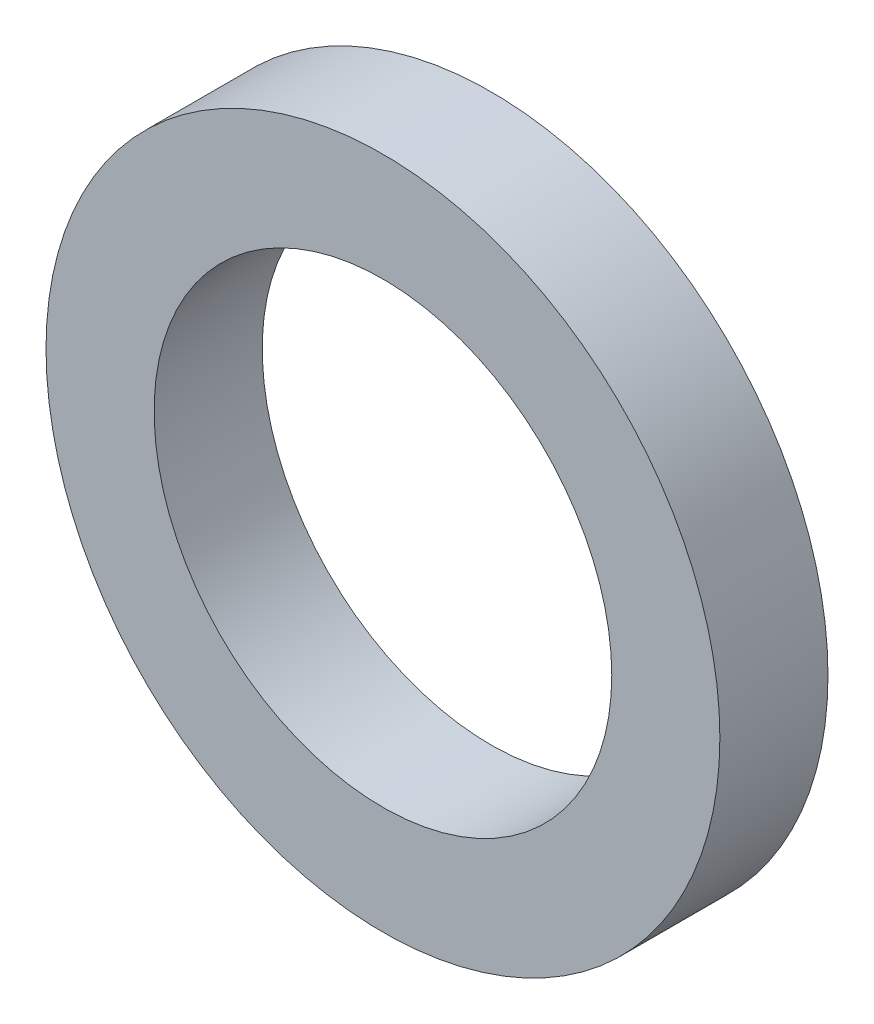
ISO-10303-21;
HEADER;
FILE_DESCRIPTION(('STEP AP214'),'2;1');
FILE_NAME('part.step','',(''),(''),'','','');
FILE_SCHEMA(('AUTOMOTIVE_DESIGN { 1 0 10303 214 1 1 1 1 }'));
ENDSEC;
DATA;
#1=APPLICATION_CONTEXT('core data for automotive mechanical design processes');
#2=APPLICATION_PROTOCOL_DEFINITION('international standard','automotive_design',2000,#1);
#3=PRODUCT_CONTEXT('',#1,'mechanical');
#4=PRODUCT('Part','Part','',(#3));
#5=PRODUCT_RELATED_PRODUCT_CATEGORY('part','',(#4));
#6=PRODUCT_DEFINITION_FORMATION('','',#4);
#7=PRODUCT_DEFINITION_CONTEXT('part definition',#1,'design');
#8=PRODUCT_DEFINITION('design','',#6,#7);
#9=PRODUCT_DEFINITION_SHAPE('','',#8);
#10=(LENGTH_UNIT() NAMED_UNIT(*) SI_UNIT(.MILLI.,.METRE.));
#11=(NAMED_UNIT(*) PLANE_ANGLE_UNIT() SI_UNIT($,.RADIAN.));
#12=(NAMED_UNIT(*) SI_UNIT($,.STERADIAN.) SOLID_ANGLE_UNIT());
#13=UNCERTAINTY_MEASURE_WITH_UNIT(LENGTH_MEASURE(1.E-05),#10,'distance_accuracy_value','');
#14=(GEOMETRIC_REPRESENTATION_CONTEXT(3) GLOBAL_UNCERTAINTY_ASSIGNED_CONTEXT((#13)) GLOBAL_UNIT_ASSIGNED_CONTEXT((#10,
#11,#12)) REPRESENTATION_CONTEXT('',''));
#15=CARTESIAN_POINT('',(0.,0.,0.));
#16=DIRECTION('',(0.,0.,1.));
#17=DIRECTION('',(1.,0.,0.));
#18=AXIS2_PLACEMENT_3D('',#15,#16,#17);
#19=CARTESIAN_POINT('',(0.,0.,3.));
#20=DIRECTION('',(0.,0.,1.));
#21=DIRECTION('',(1.,0.,0.));
#22=AXIS2_PLACEMENT_3D('',#19,#20,#21);
#23=PLANE('',#22);
#24=CARTESIAN_POINT('',(0.,0.,3.));
#25=DIRECTION('',(0.,0.,1.));
#26=DIRECTION('',(1.,0.,0.));
#27=AXIS2_PLACEMENT_3D('',#24,#25,#26);
#28=CIRCLE('',#27,9.35);
#29=CARTESIAN_POINT('',(9.35,0.,3.));
#30=VERTEX_POINT('',#29);
#31=EDGE_CURVE('E10',#30,#30,#28,.T.);
#32=ORIENTED_EDGE('',*,*,#31,.T.);
#33=EDGE_LOOP('',(#32));
#34=FACE_BOUND('',#33,.T.);
#35=CARTESIAN_POINT('',(0.,0.,3.));
#36=DIRECTION('',(0.,0.,1.));
#37=DIRECTION('',(1.,0.,0.));
#38=AXIS2_PLACEMENT_3D('',#35,#36,#37);
#39=CIRCLE('',#38,6.35);
#40=CARTESIAN_POINT('',(6.35,0.,3.));
#41=VERTEX_POINT('',#40);
#42=EDGE_CURVE('E56',#41,#41,#39,.T.);
#43=ORIENTED_EDGE('',*,*,#42,.F.);
#44=EDGE_LOOP('',(#43));
#45=FACE_BOUND('',#44,.T.);
#46=ADVANCED_FACE('F43',(#34,#45),#23,.T.);
#47=CARTESIAN_POINT('',(0.,0.,0.));
#48=DIRECTION('',(0.,0.,1.));
#49=DIRECTION('',(1.,0.,0.));
#50=AXIS2_PLACEMENT_3D('',#47,#48,#49);
#51=PLANE('',#50);
#52=CARTESIAN_POINT('',(0.,0.,0.));
#53=DIRECTION('',(0.,0.,1.));
#54=DIRECTION('',(1.,0.,0.));
#55=AXIS2_PLACEMENT_3D('',#52,#53,#54);
#56=CIRCLE('',#55,9.35);
#57=CARTESIAN_POINT('',(9.35,0.,0.));
#58=VERTEX_POINT('',#57);
#59=EDGE_CURVE('E47',#58,#58,#56,.T.);
#60=ORIENTED_EDGE('',*,*,#59,.F.);
#61=EDGE_LOOP('',(#60));
#62=FACE_BOUND('',#61,.T.);
#63=CARTESIAN_POINT('',(0.,0.,0.));
#64=DIRECTION('',(0.,0.,1.));
#65=DIRECTION('',(1.,0.,0.));
#66=AXIS2_PLACEMENT_3D('',#63,#64,#65);
#67=CIRCLE('',#66,6.35);
#68=CARTESIAN_POINT('',(6.35,0.,0.));
#69=VERTEX_POINT('',#68);
#70=EDGE_CURVE('E58',#69,#69,#67,.T.);
#71=ORIENTED_EDGE('',*,*,#70,.T.);
#72=EDGE_LOOP('',(#71));
#73=FACE_BOUND('',#72,.T.);
#74=ADVANCED_FACE('F70',(#62,#73),#51,.F.);
#75=CARTESIAN_POINT('',(0.,0.,3.));
#76=DIRECTION('',(0.,0.,-1.));
#77=DIRECTION('',(-1.,0.,0.));
#78=AXIS2_PLACEMENT_3D('',#75,#76,#77);
#79=CYLINDRICAL_SURFACE('',#78,9.35);
#80=ORIENTED_EDGE('',*,*,#31,.F.);
#81=EDGE_LOOP('',(#80));
#82=FACE_BOUND('',#81,.T.);
#83=ORIENTED_EDGE('',*,*,#59,.T.);
#84=EDGE_LOOP('',(#83));
#85=FACE_BOUND('',#84,.T.);
#86=ADVANCED_FACE('F45',(#82,#85),#79,.T.);
#87=CARTESIAN_POINT('',(0.,0.,3.));
#88=DIRECTION('',(0.,0.,-1.));
#89=DIRECTION('',(-1.,0.,0.));
#90=AXIS2_PLACEMENT_3D('',#87,#88,#89);
#91=CYLINDRICAL_SURFACE('',#90,6.35);
#92=ORIENTED_EDGE('',*,*,#42,.T.);
#93=EDGE_LOOP('',(#92));
#94=FACE_BOUND('',#93,.T.);
#95=ORIENTED_EDGE('',*,*,#70,.F.);
#96=EDGE_LOOP('',(#95));
#97=FACE_BOUND('',#96,.T.);
#98=ADVANCED_FACE('F66',(#94,#97),#91,.F.);
#99=CLOSED_SHELL('',(#46,#74,#86,#98));
#100=MANIFOLD_SOLID_BREP('B2',#99);
#101=ADVANCED_BREP_SHAPE_REPRESENTATION('',(#18,#100),#14);
#102=SHAPE_DEFINITION_REPRESENTATION(#9,#101);
ENDSEC;
END-ISO-10303-21;
